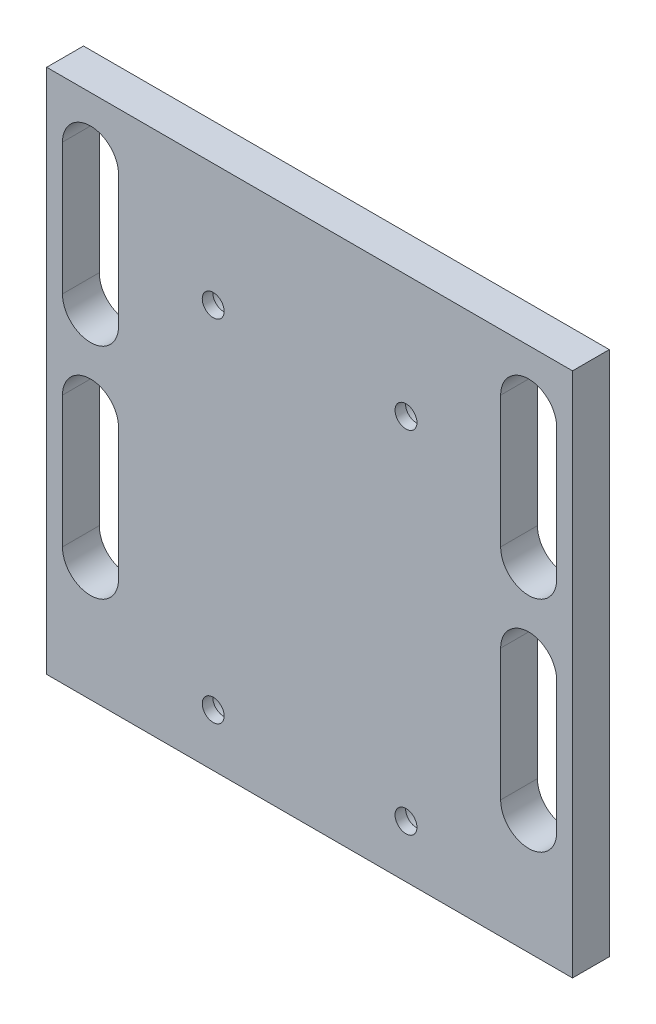
ISO-10303-21;
HEADER;
FILE_DESCRIPTION(('STEP AP214'),'2;1');
FILE_NAME('part.step','',(''),(''),'','','');
FILE_SCHEMA(('AUTOMOTIVE_DESIGN { 1 0 10303 214 1 1 1 1 }'));
ENDSEC;
DATA;
#1=APPLICATION_CONTEXT('core data for automotive mechanical design processes');
#2=APPLICATION_PROTOCOL_DEFINITION('international standard','automotive_design',2000,#1);
#3=PRODUCT_CONTEXT('',#1,'mechanical');
#4=PRODUCT('Part','Part','',(#3));
#5=PRODUCT_RELATED_PRODUCT_CATEGORY('part','',(#4));
#6=PRODUCT_DEFINITION_FORMATION('','',#4);
#7=PRODUCT_DEFINITION_CONTEXT('part definition',#1,'design');
#8=PRODUCT_DEFINITION('design','',#6,#7);
#9=PRODUCT_DEFINITION_SHAPE('','',#8);
#10=(LENGTH_UNIT() NAMED_UNIT(*) SI_UNIT(.MILLI.,.METRE.));
#11=(NAMED_UNIT(*) PLANE_ANGLE_UNIT() SI_UNIT($,.RADIAN.));
#12=(NAMED_UNIT(*) SI_UNIT($,.STERADIAN.) SOLID_ANGLE_UNIT());
#13=UNCERTAINTY_MEASURE_WITH_UNIT(LENGTH_MEASURE(1.E-05),#10,'distance_accuracy_value','');
#14=(GEOMETRIC_REPRESENTATION_CONTEXT(3) GLOBAL_UNCERTAINTY_ASSIGNED_CONTEXT((#13)) GLOBAL_UNIT_ASSIGNED_CONTEXT((#10,
#11,#12)) REPRESENTATION_CONTEXT('',''));
#15=CARTESIAN_POINT('',(0.,0.,0.));
#16=DIRECTION('',(0.,0.,1.));
#17=DIRECTION('',(1.,0.,0.));
#18=AXIS2_PLACEMENT_3D('',#15,#16,#17);
#19=CARTESIAN_POINT('',(-11.,20.,4.2));
#20=DIRECTION('',(0.,0.,-1.));
#21=DIRECTION('',(-1.,0.,0.));
#22=AXIS2_PLACEMENT_3D('',#19,#20,#21);
#23=CYLINDRICAL_SURFACE('',#22,1.25);
#24=CARTESIAN_POINT('',(-11.,20.,4.2));
#25=DIRECTION('',(0.,0.,1.));
#26=DIRECTION('',(1.,0.,0.));
#27=AXIS2_PLACEMENT_3D('',#24,#25,#26);
#28=CIRCLE('',#27,1.25);
#29=CARTESIAN_POINT('',(-9.75,20.,4.2));
#30=VERTEX_POINT('',#29);
#31=EDGE_CURVE('E312',#30,#30,#28,.T.);
#32=ORIENTED_EDGE('',*,*,#31,.T.);
#33=EDGE_LOOP('',(#32));
#34=FACE_BOUND('',#33,.T.);
#35=CARTESIAN_POINT('',(-11.,20.,3.));
#36=DIRECTION('',(0.,0.,-1.));
#37=DIRECTION('',(-1.,0.,0.));
#38=AXIS2_PLACEMENT_3D('',#35,#36,#37);
#39=CIRCLE('',#38,1.25);
#40=CARTESIAN_POINT('',(-12.25,20.,3.));
#41=VERTEX_POINT('',#40);
#42=EDGE_CURVE('E37',#41,#41,#39,.T.);
#43=ORIENTED_EDGE('',*,*,#42,.T.);
#44=EDGE_LOOP('',(#43));
#45=FACE_BOUND('',#44,.T.);
#46=ADVANCED_FACE('F33',(#34,#45),#23,.F.);
#47=CARTESIAN_POINT('',(-11.,-20.,4.2));
#48=DIRECTION('',(0.,0.,-1.));
#49=DIRECTION('',(-1.,0.,0.));
#50=AXIS2_PLACEMENT_3D('',#47,#48,#49);
#51=CYLINDRICAL_SURFACE('',#50,1.25);
#52=CARTESIAN_POINT('',(-11.,-20.,4.2));
#53=DIRECTION('',(0.,0.,1.));
#54=DIRECTION('',(-1.,0.,0.));
#55=AXIS2_PLACEMENT_3D('',#52,#53,#54);
#56=CIRCLE('',#55,1.25);
#57=CARTESIAN_POINT('',(-12.25,-20.,4.2));
#58=VERTEX_POINT('',#57);
#59=EDGE_CURVE('E309',#58,#58,#56,.T.);
#60=ORIENTED_EDGE('',*,*,#59,.T.);
#61=EDGE_LOOP('',(#60));
#62=FACE_BOUND('',#61,.T.);
#63=CARTESIAN_POINT('',(-11.,-20.,3.));
#64=DIRECTION('',(0.,0.,-1.));
#65=DIRECTION('',(-1.,0.,0.));
#66=AXIS2_PLACEMENT_3D('',#63,#64,#65);
#67=CIRCLE('',#66,1.25);
#68=CARTESIAN_POINT('',(-12.25,-20.,3.));
#69=VERTEX_POINT('',#68);
#70=EDGE_CURVE('E346',#69,#69,#67,.T.);
#71=ORIENTED_EDGE('',*,*,#70,.T.);
#72=EDGE_LOOP('',(#71));
#73=FACE_BOUND('',#72,.T.);
#74=ADVANCED_FACE('F422',(#62,#73),#51,.F.);
#75=CARTESIAN_POINT('',(11.,-20.,4.2));
#76=DIRECTION('',(0.,0.,-1.));
#77=DIRECTION('',(-1.,0.,0.));
#78=AXIS2_PLACEMENT_3D('',#75,#76,#77);
#79=CYLINDRICAL_SURFACE('',#78,1.25);
#80=CARTESIAN_POINT('',(11.,-20.,4.2));
#81=DIRECTION('',(0.,0.,1.));
#82=DIRECTION('',(1.,0.,0.));
#83=AXIS2_PLACEMENT_3D('',#80,#81,#82);
#84=CIRCLE('',#83,1.25);
#85=CARTESIAN_POINT('',(12.25,-20.,4.2));
#86=VERTEX_POINT('',#85);
#87=EDGE_CURVE('E306',#86,#86,#84,.T.);
#88=ORIENTED_EDGE('',*,*,#87,.T.);
#89=EDGE_LOOP('',(#88));
#90=FACE_BOUND('',#89,.T.);
#91=CARTESIAN_POINT('',(11.,-20.,3.));
#92=DIRECTION('',(0.,0.,-1.));
#93=DIRECTION('',(-1.,0.,0.));
#94=AXIS2_PLACEMENT_3D('',#91,#92,#93);
#95=CIRCLE('',#94,1.25);
#96=CARTESIAN_POINT('',(9.75,-20.,3.));
#97=VERTEX_POINT('',#96);
#98=EDGE_CURVE('E344',#97,#97,#95,.T.);
#99=ORIENTED_EDGE('',*,*,#98,.T.);
#100=EDGE_LOOP('',(#99));
#101=FACE_BOUND('',#100,.T.);
#102=ADVANCED_FACE('F428',(#90,#101),#79,.F.);
#103=CARTESIAN_POINT('',(11.,20.,4.2));
#104=DIRECTION('',(0.,0.,-1.));
#105=DIRECTION('',(-1.,0.,0.));
#106=AXIS2_PLACEMENT_3D('',#103,#104,#105);
#107=CYLINDRICAL_SURFACE('',#106,1.25);
#108=CARTESIAN_POINT('',(11.,20.,4.2));
#109=DIRECTION('',(0.,0.,1.));
#110=DIRECTION('',(-1.,0.,0.));
#111=AXIS2_PLACEMENT_3D('',#108,#109,#110);
#112=CIRCLE('',#111,1.25);
#113=CARTESIAN_POINT('',(9.75,20.,4.2));
#114=VERTEX_POINT('',#113);
#115=EDGE_CURVE('E303',#114,#114,#112,.T.);
#116=ORIENTED_EDGE('',*,*,#115,.T.);
#117=EDGE_LOOP('',(#116));
#118=FACE_BOUND('',#117,.T.);
#119=CARTESIAN_POINT('',(11.,20.,3.));
#120=DIRECTION('',(0.,0.,-1.));
#121=DIRECTION('',(-1.,0.,0.));
#122=AXIS2_PLACEMENT_3D('',#119,#120,#121);
#123=CIRCLE('',#122,1.25);
#124=CARTESIAN_POINT('',(9.75,20.,3.));
#125=VERTEX_POINT('',#124);
#126=EDGE_CURVE('E201',#125,#125,#123,.T.);
#127=ORIENTED_EDGE('',*,*,#126,.T.);
#128=EDGE_LOOP('',(#127));
#129=FACE_BOUND('',#128,.T.);
#130=ADVANCED_FACE('F434',(#118,#129),#107,.F.);
#131=CARTESIAN_POINT('',(0.,0.,4.2));
#132=DIRECTION('',(0.,0.,-1.));
#133=DIRECTION('',(-1.,0.,0.));
#134=AXIS2_PLACEMENT_3D('',#131,#132,#133);
#135=PLANE('',#134);
#136=CARTESIAN_POINT('',(25.,27.5,4.2));
#137=DIRECTION('',(0.,0.,1.));
#138=DIRECTION('',(1.,0.,0.));
#139=AXIS2_PLACEMENT_3D('',#136,#137,#138);
#140=CIRCLE('',#139,3.20000000000001);
#141=CARTESIAN_POINT('',(28.2,27.5,4.2));
#142=VERTEX_POINT('',#141);
#143=CARTESIAN_POINT('',(21.8,27.5,4.2));
#144=VERTEX_POINT('',#143);
#145=EDGE_CURVE('E211',#142,#144,#140,.T.);
#146=ORIENTED_EDGE('',*,*,#145,.F.);
#147=DIRECTION('',(0.,1.,0.));
#148=VECTOR('',#147,1.);
#149=CARTESIAN_POINT('',(28.2,27.5,4.2));
#150=LINE('',#149,#148);
#151=CARTESIAN_POINT('',(28.2,12.5,4.2));
#152=VERTEX_POINT('',#151);
#153=EDGE_CURVE('E219',#152,#142,#150,.T.);
#154=ORIENTED_EDGE('',*,*,#153,.F.);
#155=CARTESIAN_POINT('',(25.,12.5,4.2));
#156=DIRECTION('',(0.,0.,1.));
#157=DIRECTION('',(-1.,0.,0.));
#158=AXIS2_PLACEMENT_3D('',#155,#156,#157);
#159=CIRCLE('',#158,3.20000000000001);
#160=CARTESIAN_POINT('',(21.8,12.5,4.2));
#161=VERTEX_POINT('',#160);
#162=EDGE_CURVE('E216',#161,#152,#159,.T.);
#163=ORIENTED_EDGE('',*,*,#162,.F.);
#164=DIRECTION('',(0.,-1.,0.));
#165=VECTOR('',#164,1.);
#166=CARTESIAN_POINT('',(21.8,27.5,4.2));
#167=LINE('',#166,#165);
#168=EDGE_CURVE('E213',#144,#161,#167,.T.);
#169=ORIENTED_EDGE('',*,*,#168,.F.);
#170=EDGE_LOOP('',(#146,#154,#163,#169));
#171=FACE_BOUND('',#170,.T.);
#172=CARTESIAN_POINT('',(-25.,27.5,4.2));
#173=DIRECTION('',(0.,0.,1.));
#174=DIRECTION('',(1.,0.,0.));
#175=AXIS2_PLACEMENT_3D('',#172,#173,#174);
#176=CIRCLE('',#175,3.20000000000001);
#177=CARTESIAN_POINT('',(-21.8,27.5,4.2));
#178=VERTEX_POINT('',#177);
#179=CARTESIAN_POINT('',(-28.2,27.5,4.2));
#180=VERTEX_POINT('',#179);
#181=EDGE_CURVE('E273',#178,#180,#176,.T.);
#182=ORIENTED_EDGE('',*,*,#181,.F.);
#183=DIRECTION('',(0.,1.,0.));
#184=VECTOR('',#183,1.);
#185=CARTESIAN_POINT('',(-21.8,27.5,4.2));
#186=LINE('',#185,#184);
#187=CARTESIAN_POINT('',(-21.8,12.5,4.2));
#188=VERTEX_POINT('',#187);
#189=EDGE_CURVE('E281',#188,#178,#186,.T.);
#190=ORIENTED_EDGE('',*,*,#189,.F.);
#191=CARTESIAN_POINT('',(-25.,12.5,4.2));
#192=DIRECTION('',(0.,0.,1.));
#193=DIRECTION('',(1.,0.,0.));
#194=AXIS2_PLACEMENT_3D('',#191,#192,#193);
#195=CIRCLE('',#194,3.20000000000001);
#196=CARTESIAN_POINT('',(-28.2,12.5,4.2));
#197=VERTEX_POINT('',#196);
#198=EDGE_CURVE('E278',#197,#188,#195,.T.);
#199=ORIENTED_EDGE('',*,*,#198,.F.);
#200=DIRECTION('',(0.,-1.,0.));
#201=VECTOR('',#200,1.);
#202=CARTESIAN_POINT('',(-28.2,27.5,4.2));
#203=LINE('',#202,#201);
#204=EDGE_CURVE('E275',#180,#197,#203,.T.);
#205=ORIENTED_EDGE('',*,*,#204,.F.);
#206=EDGE_LOOP('',(#182,#190,#199,#205));
#207=FACE_BOUND('',#206,.T.);
#208=DIRECTION('',(0.,-1.,0.));
#209=VECTOR('',#208,1.);
#210=CARTESIAN_POINT('',(-30.,-26.,4.2));
#211=LINE('',#210,#209);
#212=CARTESIAN_POINT('',(-30.,34.,4.2));
#213=VERTEX_POINT('',#212);
#214=CARTESIAN_POINT('',(-30.,-26.,4.2));
#215=VERTEX_POINT('',#214);
#216=EDGE_CURVE('E316',#213,#215,#211,.T.);
#217=ORIENTED_EDGE('',*,*,#216,.T.);
#218=DIRECTION('',(1.,0.,0.));
#219=VECTOR('',#218,1.);
#220=CARTESIAN_POINT('',(-30.,-26.,4.2));
#221=LINE('',#220,#219);
#222=CARTESIAN_POINT('',(30.,-26.,4.2));
#223=VERTEX_POINT('',#222);
#224=EDGE_CURVE('E319',#215,#223,#221,.T.);
#225=ORIENTED_EDGE('',*,*,#224,.T.);
#226=DIRECTION('',(0.,1.,0.));
#227=VECTOR('',#226,1.);
#228=CARTESIAN_POINT('',(30.,34.,4.2));
#229=LINE('',#228,#227);
#230=CARTESIAN_POINT('',(30.,34.,4.2));
#231=VERTEX_POINT('',#230);
#232=EDGE_CURVE('E322',#223,#231,#229,.T.);
#233=ORIENTED_EDGE('',*,*,#232,.T.);
#234=DIRECTION('',(-1.,0.,0.));
#235=VECTOR('',#234,1.);
#236=CARTESIAN_POINT('',(-30.,34.,4.2));
#237=LINE('',#236,#235);
#238=EDGE_CURVE('E324',#231,#213,#237,.T.);
#239=ORIENTED_EDGE('',*,*,#238,.T.);
#240=EDGE_LOOP('',(#217,#225,#233,#239));
#241=FACE_BOUND('',#240,.T.);
#242=ORIENTED_EDGE('',*,*,#31,.F.);
#243=EDGE_LOOP('',(#242));
#244=FACE_BOUND('',#243,.T.);
#245=ORIENTED_EDGE('',*,*,#59,.F.);
#246=EDGE_LOOP('',(#245));
#247=FACE_BOUND('',#246,.T.);
#248=ORIENTED_EDGE('',*,*,#87,.F.);
#249=EDGE_LOOP('',(#248));
#250=FACE_BOUND('',#249,.T.);
#251=ORIENTED_EDGE('',*,*,#115,.F.);
#252=EDGE_LOOP('',(#251));
#253=FACE_BOUND('',#252,.T.);
#254=CARTESIAN_POINT('',(-25.,2.5,4.2));
#255=DIRECTION('',(0.,0.,1.));
#256=DIRECTION('',(1.,0.,0.));
#257=AXIS2_PLACEMENT_3D('',#254,#255,#256);
#258=CIRCLE('',#257,3.2);
#259=CARTESIAN_POINT('',(-21.8,2.5,4.2));
#260=VERTEX_POINT('',#259);
#261=CARTESIAN_POINT('',(-28.2,2.5,4.2));
#262=VERTEX_POINT('',#261);
#263=EDGE_CURVE('E242',#260,#262,#258,.T.);
#264=ORIENTED_EDGE('',*,*,#263,.F.);
#265=DIRECTION('',(0.,1.,0.));
#266=VECTOR('',#265,1.);
#267=CARTESIAN_POINT('',(-21.8,2.5,4.2));
#268=LINE('',#267,#266);
#269=CARTESIAN_POINT('',(-21.8,-12.5,4.2));
#270=VERTEX_POINT('',#269);
#271=EDGE_CURVE('E250',#270,#260,#268,.T.);
#272=ORIENTED_EDGE('',*,*,#271,.F.);
#273=CARTESIAN_POINT('',(-25.,-12.5,4.2));
#274=DIRECTION('',(0.,0.,1.));
#275=DIRECTION('',(-1.,0.,0.));
#276=AXIS2_PLACEMENT_3D('',#273,#274,#275);
#277=CIRCLE('',#276,3.20000000000001);
#278=CARTESIAN_POINT('',(-28.2,-12.5,4.2));
#279=VERTEX_POINT('',#278);
#280=EDGE_CURVE('E247',#279,#270,#277,.T.);
#281=ORIENTED_EDGE('',*,*,#280,.F.);
#282=DIRECTION('',(0.,-1.,0.));
#283=VECTOR('',#282,1.);
#284=CARTESIAN_POINT('',(-28.2,2.5,4.2));
#285=LINE('',#284,#283);
#286=EDGE_CURVE('E244',#262,#279,#285,.T.);
#287=ORIENTED_EDGE('',*,*,#286,.F.);
#288=EDGE_LOOP('',(#264,#272,#281,#287));
#289=FACE_BOUND('',#288,.T.);
#290=CARTESIAN_POINT('',(25.,2.5,4.2));
#291=DIRECTION('',(0.,0.,1.));
#292=DIRECTION('',(1.,0.,0.));
#293=AXIS2_PLACEMENT_3D('',#290,#291,#292);
#294=CIRCLE('',#293,3.2);
#295=CARTESIAN_POINT('',(28.2,2.5,4.2));
#296=VERTEX_POINT('',#295);
#297=CARTESIAN_POINT('',(21.8,2.5,4.2));
#298=VERTEX_POINT('',#297);
#299=EDGE_CURVE('E172',#296,#298,#294,.T.);
#300=ORIENTED_EDGE('',*,*,#299,.F.);
#301=DIRECTION('',(0.,1.,0.));
#302=VECTOR('',#301,1.);
#303=CARTESIAN_POINT('',(28.2,2.5,4.2));
#304=LINE('',#303,#302);
#305=CARTESIAN_POINT('',(28.2,-12.5,4.2));
#306=VERTEX_POINT('',#305);
#307=EDGE_CURVE('E195',#306,#296,#304,.T.);
#308=ORIENTED_EDGE('',*,*,#307,.F.);
#309=CARTESIAN_POINT('',(25.,-12.5,4.2));
#310=DIRECTION('',(0.,0.,1.));
#311=DIRECTION('',(1.,0.,0.));
#312=AXIS2_PLACEMENT_3D('',#309,#310,#311);
#313=CIRCLE('',#312,3.20000000000001);
#314=CARTESIAN_POINT('',(21.8,-12.5,4.2));
#315=VERTEX_POINT('',#314);
#316=EDGE_CURVE('E193',#315,#306,#313,.T.);
#317=ORIENTED_EDGE('',*,*,#316,.F.);
#318=DIRECTION('',(0.,-1.,0.));
#319=VECTOR('',#318,1.);
#320=CARTESIAN_POINT('',(21.8,2.5,4.2));
#321=LINE('',#320,#319);
#322=EDGE_CURVE('E180',#298,#315,#321,.T.);
#323=ORIENTED_EDGE('',*,*,#322,.F.);
#324=EDGE_LOOP('',(#300,#308,#317,#323));
#325=FACE_BOUND('',#324,.T.);
#326=ADVANCED_FACE('F192',(#171,#207,#241,#244,#247,#250,#253,#289,#325),#135,.F.);
#327=CARTESIAN_POINT('',(0.,0.,0.));
#328=DIRECTION('',(0.,0.,-1.));
#329=DIRECTION('',(-1.,0.,0.));
#330=AXIS2_PLACEMENT_3D('',#327,#328,#329);
#331=PLANE('',#330);
#332=CARTESIAN_POINT('',(-11.,20.,0.));
#333=DIRECTION('',(0.,0.,-1.));
#334=DIRECTION('',(-1.,0.,0.));
#335=AXIS2_PLACEMENT_3D('',#332,#333,#334);
#336=CIRCLE('',#335,2.5);
#337=CARTESIAN_POINT('',(-13.5,20.,0.));
#338=VERTEX_POINT('',#337);
#339=EDGE_CURVE('E373',#338,#338,#336,.T.);
#340=ORIENTED_EDGE('',*,*,#339,.F.);
#341=EDGE_LOOP('',(#340));
#342=FACE_BOUND('',#341,.T.);
#343=CARTESIAN_POINT('',(11.,-20.,0.));
#344=DIRECTION('',(0.,0.,-1.));
#345=DIRECTION('',(-1.,0.,0.));
#346=AXIS2_PLACEMENT_3D('',#343,#344,#345);
#347=CIRCLE('',#346,2.5);
#348=CARTESIAN_POINT('',(8.49999999999999,-20.,0.));
#349=VERTEX_POINT('',#348);
#350=EDGE_CURVE('E367',#349,#349,#347,.T.);
#351=ORIENTED_EDGE('',*,*,#350,.F.);
#352=EDGE_LOOP('',(#351));
#353=FACE_BOUND('',#352,.T.);
#354=CARTESIAN_POINT('',(-11.,-20.,0.));
#355=DIRECTION('',(0.,0.,-1.));
#356=DIRECTION('',(-1.,0.,0.));
#357=AXIS2_PLACEMENT_3D('',#354,#355,#356);
#358=CIRCLE('',#357,2.5);
#359=CARTESIAN_POINT('',(-13.5,-20.,0.));
#360=VERTEX_POINT('',#359);
#361=EDGE_CURVE('E361',#360,#360,#358,.T.);
#362=ORIENTED_EDGE('',*,*,#361,.F.);
#363=EDGE_LOOP('',(#362));
#364=FACE_BOUND('',#363,.T.);
#365=CARTESIAN_POINT('',(11.,20.,0.));
#366=DIRECTION('',(0.,0.,-1.));
#367=DIRECTION('',(-1.,0.,0.));
#368=AXIS2_PLACEMENT_3D('',#365,#366,#367);
#369=CIRCLE('',#368,2.5);
#370=CARTESIAN_POINT('',(8.5,20.,0.));
#371=VERTEX_POINT('',#370);
#372=EDGE_CURVE('E352',#371,#371,#369,.T.);
#373=ORIENTED_EDGE('',*,*,#372,.F.);
#374=EDGE_LOOP('',(#373));
#375=FACE_BOUND('',#374,.T.);
#376=DIRECTION('',(0.,-1.,0.));
#377=VECTOR('',#376,1.);
#378=CARTESIAN_POINT('',(-30.,-26.,0.));
#379=LINE('',#378,#377);
#380=CARTESIAN_POINT('',(-30.,34.,0.));
#381=VERTEX_POINT('',#380);
#382=CARTESIAN_POINT('',(-30.,-26.,0.));
#383=VERTEX_POINT('',#382);
#384=EDGE_CURVE('E315',#381,#383,#379,.T.);
#385=ORIENTED_EDGE('',*,*,#384,.F.);
#386=DIRECTION('',(-1.,0.,0.));
#387=VECTOR('',#386,1.);
#388=CARTESIAN_POINT('',(-30.,34.,0.));
#389=LINE('',#388,#387);
#390=CARTESIAN_POINT('',(30.,34.,0.));
#391=VERTEX_POINT('',#390);
#392=EDGE_CURVE('E320',#391,#381,#389,.T.);
#393=ORIENTED_EDGE('',*,*,#392,.F.);
#394=DIRECTION('',(0.,1.,0.));
#395=VECTOR('',#394,1.);
#396=CARTESIAN_POINT('',(30.,34.,0.));
#397=LINE('',#396,#395);
#398=CARTESIAN_POINT('',(30.,-26.,0.));
#399=VERTEX_POINT('',#398);
#400=EDGE_CURVE('E331',#399,#391,#397,.T.);
#401=ORIENTED_EDGE('',*,*,#400,.F.);
#402=DIRECTION('',(1.,0.,0.));
#403=VECTOR('',#402,1.);
#404=CARTESIAN_POINT('',(-30.,-26.,0.));
#405=LINE('',#404,#403);
#406=EDGE_CURVE('E329',#383,#399,#405,.T.);
#407=ORIENTED_EDGE('',*,*,#406,.F.);
#408=EDGE_LOOP('',(#385,#393,#401,#407));
#409=FACE_BOUND('',#408,.T.);
#410=DIRECTION('',(0.,1.,0.));
#411=VECTOR('',#410,1.);
#412=CARTESIAN_POINT('',(-21.8,27.5,0.));
#413=LINE('',#412,#411);
#414=CARTESIAN_POINT('',(-21.8,12.5,0.));
#415=VERTEX_POINT('',#414);
#416=CARTESIAN_POINT('',(-21.8,27.5,0.));
#417=VERTEX_POINT('',#416);
#418=EDGE_CURVE('E276',#415,#417,#413,.T.);
#419=ORIENTED_EDGE('',*,*,#418,.T.);
#420=CARTESIAN_POINT('',(-25.,27.5,0.));
#421=DIRECTION('',(0.,0.,1.));
#422=DIRECTION('',(1.,0.,0.));
#423=AXIS2_PLACEMENT_3D('',#420,#421,#422);
#424=CIRCLE('',#423,3.20000000000001);
#425=CARTESIAN_POINT('',(-28.2,27.5,0.));
#426=VERTEX_POINT('',#425);
#427=EDGE_CURVE('E272',#417,#426,#424,.T.);
#428=ORIENTED_EDGE('',*,*,#427,.T.);
#429=DIRECTION('',(0.,-1.,0.));
#430=VECTOR('',#429,1.);
#431=CARTESIAN_POINT('',(-28.2,27.5,0.));
#432=LINE('',#431,#430);
#433=CARTESIAN_POINT('',(-28.2,12.5,0.));
#434=VERTEX_POINT('',#433);
#435=EDGE_CURVE('E286',#426,#434,#432,.T.);
#436=ORIENTED_EDGE('',*,*,#435,.T.);
#437=CARTESIAN_POINT('',(-25.,12.5,0.));
#438=DIRECTION('',(0.,0.,1.));
#439=DIRECTION('',(1.,0.,0.));
#440=AXIS2_PLACEMENT_3D('',#437,#438,#439);
#441=CIRCLE('',#440,3.20000000000001);
#442=EDGE_CURVE('E289',#434,#415,#441,.T.);
#443=ORIENTED_EDGE('',*,*,#442,.T.);
#444=EDGE_LOOP('',(#419,#428,#436,#443));
#445=FACE_BOUND('',#444,.T.);
#446=DIRECTION('',(0.,1.,0.));
#447=VECTOR('',#446,1.);
#448=CARTESIAN_POINT('',(-21.8,2.5,0.));
#449=LINE('',#448,#447);
#450=CARTESIAN_POINT('',(-21.8,-12.5,0.));
#451=VERTEX_POINT('',#450);
#452=CARTESIAN_POINT('',(-21.8,2.5,0.));
#453=VERTEX_POINT('',#452);
#454=EDGE_CURVE('E245',#451,#453,#449,.T.);
#455=ORIENTED_EDGE('',*,*,#454,.T.);
#456=CARTESIAN_POINT('',(-25.,2.5,0.));
#457=DIRECTION('',(0.,0.,1.));
#458=DIRECTION('',(1.,0.,0.));
#459=AXIS2_PLACEMENT_3D('',#456,#457,#458);
#460=CIRCLE('',#459,3.2);
#461=CARTESIAN_POINT('',(-28.2,2.5,0.));
#462=VERTEX_POINT('',#461);
#463=EDGE_CURVE('E241',#453,#462,#460,.T.);
#464=ORIENTED_EDGE('',*,*,#463,.T.);
#465=DIRECTION('',(0.,-1.,0.));
#466=VECTOR('',#465,1.);
#467=CARTESIAN_POINT('',(-28.2,2.5,0.));
#468=LINE('',#467,#466);
#469=CARTESIAN_POINT('',(-28.2,-12.5,0.));
#470=VERTEX_POINT('',#469);
#471=EDGE_CURVE('E255',#462,#470,#468,.T.);
#472=ORIENTED_EDGE('',*,*,#471,.T.);
#473=CARTESIAN_POINT('',(-25.,-12.5,0.));
#474=DIRECTION('',(0.,0.,1.));
#475=DIRECTION('',(-1.,0.,0.));
#476=AXIS2_PLACEMENT_3D('',#473,#474,#475);
#477=CIRCLE('',#476,3.20000000000001);
#478=EDGE_CURVE('E258',#470,#451,#477,.T.);
#479=ORIENTED_EDGE('',*,*,#478,.T.);
#480=EDGE_LOOP('',(#455,#464,#472,#479));
#481=FACE_BOUND('',#480,.T.);
#482=DIRECTION('',(0.,1.,0.));
#483=VECTOR('',#482,1.);
#484=CARTESIAN_POINT('',(28.2,27.5,0.));
#485=LINE('',#484,#483);
#486=CARTESIAN_POINT('',(28.2,12.5,0.));
#487=VERTEX_POINT('',#486);
#488=CARTESIAN_POINT('',(28.2,27.5,0.));
#489=VERTEX_POINT('',#488);
#490=EDGE_CURVE('E214',#487,#489,#485,.T.);
#491=ORIENTED_EDGE('',*,*,#490,.T.);
#492=CARTESIAN_POINT('',(25.,27.5,0.));
#493=DIRECTION('',(0.,0.,1.));
#494=DIRECTION('',(1.,0.,0.));
#495=AXIS2_PLACEMENT_3D('',#492,#493,#494);
#496=CIRCLE('',#495,3.20000000000001);
#497=CARTESIAN_POINT('',(21.8,27.5,0.));
#498=VERTEX_POINT('',#497);
#499=EDGE_CURVE('E188',#489,#498,#496,.T.);
#500=ORIENTED_EDGE('',*,*,#499,.T.);
#501=DIRECTION('',(0.,-1.,0.));
#502=VECTOR('',#501,1.);
#503=CARTESIAN_POINT('',(21.8,27.5,0.));
#504=LINE('',#503,#502);
#505=CARTESIAN_POINT('',(21.8,12.5,0.));
#506=VERTEX_POINT('',#505);
#507=EDGE_CURVE('E224',#498,#506,#504,.T.);
#508=ORIENTED_EDGE('',*,*,#507,.T.);
#509=CARTESIAN_POINT('',(25.,12.5,0.));
#510=DIRECTION('',(0.,0.,1.));
#511=DIRECTION('',(-1.,0.,0.));
#512=AXIS2_PLACEMENT_3D('',#509,#510,#511);
#513=CIRCLE('',#512,3.20000000000001);
#514=EDGE_CURVE('E227',#506,#487,#513,.T.);
#515=ORIENTED_EDGE('',*,*,#514,.T.);
#516=EDGE_LOOP('',(#491,#500,#508,#515));
#517=FACE_BOUND('',#516,.T.);
#518=DIRECTION('',(0.,1.,0.));
#519=VECTOR('',#518,1.);
#520=CARTESIAN_POINT('',(28.2,2.5,0.));
#521=LINE('',#520,#519);
#522=CARTESIAN_POINT('',(28.2,-12.5,0.));
#523=VERTEX_POINT('',#522);
#524=CARTESIAN_POINT('',(28.2,2.5,0.));
#525=VERTEX_POINT('',#524);
#526=EDGE_CURVE('E181',#523,#525,#521,.T.);
#527=ORIENTED_EDGE('',*,*,#526,.T.);
#528=CARTESIAN_POINT('',(25.,2.5,0.));
#529=DIRECTION('',(0.,0.,1.));
#530=DIRECTION('',(1.,0.,0.));
#531=AXIS2_PLACEMENT_3D('',#528,#529,#530);
#532=CIRCLE('',#531,3.2);
#533=CARTESIAN_POINT('',(21.8,2.5,0.));
#534=VERTEX_POINT('',#533);
#535=EDGE_CURVE('E58',#525,#534,#532,.T.);
#536=ORIENTED_EDGE('',*,*,#535,.T.);
#537=DIRECTION('',(0.,-1.,0.));
#538=VECTOR('',#537,1.);
#539=CARTESIAN_POINT('',(21.8,2.5,0.));
#540=LINE('',#539,#538);
#541=CARTESIAN_POINT('',(21.8,-12.5,0.));
#542=VERTEX_POINT('',#541);
#543=EDGE_CURVE('E187',#534,#542,#540,.T.);
#544=ORIENTED_EDGE('',*,*,#543,.T.);
#545=CARTESIAN_POINT('',(25.,-12.5,0.));
#546=DIRECTION('',(0.,0.,1.));
#547=DIRECTION('',(1.,0.,0.));
#548=AXIS2_PLACEMENT_3D('',#545,#546,#547);
#549=CIRCLE('',#548,3.20000000000001);
#550=EDGE_CURVE('E203',#542,#523,#549,.T.);
#551=ORIENTED_EDGE('',*,*,#550,.T.);
#552=EDGE_LOOP('',(#527,#536,#544,#551));
#553=FACE_BOUND('',#552,.T.);
#554=ADVANCED_FACE('F388',(#342,#353,#364,#375,#409,#445,#481,#517,#553),#331,.T.);
#555=CARTESIAN_POINT('',(-30.,-26.,4.2));
#556=DIRECTION('',(1.,0.,0.));
#557=DIRECTION('',(0.,0.,-1.));
#558=AXIS2_PLACEMENT_3D('',#555,#556,#557);
#559=PLANE('',#558);
#560=ORIENTED_EDGE('',*,*,#384,.T.);
#561=DIRECTION('',(0.,0.,-1.));
#562=VECTOR('',#561,1.);
#563=CARTESIAN_POINT('',(-30.,-26.,4.2));
#564=LINE('',#563,#562);
#565=EDGE_CURVE('E11',#215,#383,#564,.T.);
#566=ORIENTED_EDGE('',*,*,#565,.F.);
#567=ORIENTED_EDGE('',*,*,#216,.F.);
#568=DIRECTION('',(0.,0.,-1.));
#569=VECTOR('',#568,1.);
#570=CARTESIAN_POINT('',(-30.,34.,4.2));
#571=LINE('',#570,#569);
#572=EDGE_CURVE('E326',#213,#381,#571,.T.);
#573=ORIENTED_EDGE('',*,*,#572,.T.);
#574=EDGE_LOOP('',(#560,#566,#567,#573));
#575=FACE_BOUND('',#574,.T.);
#576=ADVANCED_FACE('F35',(#575),#559,.F.);
#577=CARTESIAN_POINT('',(-30.,-26.,4.2));
#578=DIRECTION('',(0.,1.,0.));
#579=DIRECTION('',(0.,0.,1.));
#580=AXIS2_PLACEMENT_3D('',#577,#578,#579);
#581=PLANE('',#580);
#582=ORIENTED_EDGE('',*,*,#406,.T.);
#583=DIRECTION('',(0.,0.,-1.));
#584=VECTOR('',#583,1.);
#585=CARTESIAN_POINT('',(30.,-26.,4.2));
#586=LINE('',#585,#584);
#587=EDGE_CURVE('E42',#223,#399,#586,.T.);
#588=ORIENTED_EDGE('',*,*,#587,.F.);
#589=ORIENTED_EDGE('',*,*,#224,.F.);
#590=ORIENTED_EDGE('',*,*,#565,.T.);
#591=EDGE_LOOP('',(#582,#588,#589,#590));
#592=FACE_BOUND('',#591,.T.);
#593=ADVANCED_FACE('F444',(#592),#581,.F.);
#594=CARTESIAN_POINT('',(30.,34.,4.2));
#595=DIRECTION('',(-1.,0.,0.));
#596=DIRECTION('',(0.,-1.,0.));
#597=AXIS2_PLACEMENT_3D('',#594,#595,#596);
#598=PLANE('',#597);
#599=ORIENTED_EDGE('',*,*,#400,.T.);
#600=DIRECTION('',(0.,0.,-1.));
#601=VECTOR('',#600,1.);
#602=CARTESIAN_POINT('',(30.,34.,4.2));
#603=LINE('',#602,#601);
#604=EDGE_CURVE('E336',#231,#391,#603,.T.);
#605=ORIENTED_EDGE('',*,*,#604,.F.);
#606=ORIENTED_EDGE('',*,*,#232,.F.);
#607=ORIENTED_EDGE('',*,*,#587,.T.);
#608=EDGE_LOOP('',(#599,#605,#606,#607));
#609=FACE_BOUND('',#608,.T.);
#610=ADVANCED_FACE('F441',(#609),#598,.F.);
#611=CARTESIAN_POINT('',(-30.,34.,4.2));
#612=DIRECTION('',(0.,-1.,0.));
#613=DIRECTION('',(0.,0.,-1.));
#614=AXIS2_PLACEMENT_3D('',#611,#612,#613);
#615=PLANE('',#614);
#616=ORIENTED_EDGE('',*,*,#392,.T.);
#617=ORIENTED_EDGE('',*,*,#572,.F.);
#618=ORIENTED_EDGE('',*,*,#238,.F.);
#619=ORIENTED_EDGE('',*,*,#604,.T.);
#620=EDGE_LOOP('',(#616,#617,#618,#619));
#621=FACE_BOUND('',#620,.T.);
#622=ADVANCED_FACE('F437',(#621),#615,.F.);
#623=CARTESIAN_POINT('',(-25.,27.5,4.2));
#624=DIRECTION('',(0.,0.,-1.));
#625=DIRECTION('',(-1.,0.,0.));
#626=AXIS2_PLACEMENT_3D('',#623,#624,#625);
#627=CYLINDRICAL_SURFACE('',#626,3.20000000000001);
#628=ORIENTED_EDGE('',*,*,#427,.F.);
#629=DIRECTION('',(0.,0.,-1.));
#630=VECTOR('',#629,1.);
#631=CARTESIAN_POINT('',(-21.8,27.5,4.2));
#632=LINE('',#631,#630);
#633=EDGE_CURVE('E283',#178,#417,#632,.T.);
#634=ORIENTED_EDGE('',*,*,#633,.F.);
#635=ORIENTED_EDGE('',*,*,#181,.T.);
#636=DIRECTION('',(0.,0.,-1.));
#637=VECTOR('',#636,1.);
#638=CARTESIAN_POINT('',(-28.2,27.5,4.2));
#639=LINE('',#638,#637);
#640=EDGE_CURVE('E300',#180,#426,#639,.T.);
#641=ORIENTED_EDGE('',*,*,#640,.T.);
#642=EDGE_LOOP('',(#628,#634,#635,#641));
#643=FACE_BOUND('',#642,.T.);
#644=ADVANCED_FACE('F440',(#643),#627,.F.);
#645=CARTESIAN_POINT('',(-28.2,27.5,4.2));
#646=DIRECTION('',(1.,0.,0.));
#647=DIRECTION('',(0.,0.,-1.));
#648=AXIS2_PLACEMENT_3D('',#645,#646,#647);
#649=PLANE('',#648);
#650=ORIENTED_EDGE('',*,*,#435,.F.);
#651=ORIENTED_EDGE('',*,*,#640,.F.);
#652=ORIENTED_EDGE('',*,*,#204,.T.);
#653=DIRECTION('',(0.,0.,-1.));
#654=VECTOR('',#653,1.);
#655=CARTESIAN_POINT('',(-28.2,12.5,4.2));
#656=LINE('',#655,#654);
#657=EDGE_CURVE('E298',#197,#434,#656,.T.);
#658=ORIENTED_EDGE('',*,*,#657,.T.);
#659=EDGE_LOOP('',(#650,#651,#652,#658));
#660=FACE_BOUND('',#659,.T.);
#661=ADVANCED_FACE('F506',(#660),#649,.T.);
#662=CARTESIAN_POINT('',(-25.,12.5,4.2));
#663=DIRECTION('',(0.,0.,-1.));
#664=DIRECTION('',(-1.,0.,0.));
#665=AXIS2_PLACEMENT_3D('',#662,#663,#664);
#666=CYLINDRICAL_SURFACE('',#665,3.20000000000001);
#667=ORIENTED_EDGE('',*,*,#442,.F.);
#668=ORIENTED_EDGE('',*,*,#657,.F.);
#669=ORIENTED_EDGE('',*,*,#198,.T.);
#670=DIRECTION('',(0.,0.,-1.));
#671=VECTOR('',#670,1.);
#672=CARTESIAN_POINT('',(-21.8,12.5,4.2));
#673=LINE('',#672,#671);
#674=EDGE_CURVE('E296',#188,#415,#673,.T.);
#675=ORIENTED_EDGE('',*,*,#674,.T.);
#676=EDGE_LOOP('',(#667,#668,#669,#675));
#677=FACE_BOUND('',#676,.T.);
#678=ADVANCED_FACE('F502',(#677),#666,.F.);
#679=CARTESIAN_POINT('',(-21.8,27.5,4.2));
#680=DIRECTION('',(-1.,0.,0.));
#681=DIRECTION('',(0.,0.,1.));
#682=AXIS2_PLACEMENT_3D('',#679,#680,#681);
#683=PLANE('',#682);
#684=ORIENTED_EDGE('',*,*,#418,.F.);
#685=ORIENTED_EDGE('',*,*,#674,.F.);
#686=ORIENTED_EDGE('',*,*,#189,.T.);
#687=ORIENTED_EDGE('',*,*,#633,.T.);
#688=EDGE_LOOP('',(#684,#685,#686,#687));
#689=FACE_BOUND('',#688,.T.);
#690=ADVANCED_FACE('F499',(#689),#683,.T.);
#691=CARTESIAN_POINT('',(-25.,2.5,4.2));
#692=DIRECTION('',(0.,0.,-1.));
#693=DIRECTION('',(-1.,0.,0.));
#694=AXIS2_PLACEMENT_3D('',#691,#692,#693);
#695=CYLINDRICAL_SURFACE('',#694,3.2);
#696=ORIENTED_EDGE('',*,*,#463,.F.);
#697=DIRECTION('',(0.,0.,-1.));
#698=VECTOR('',#697,1.);
#699=CARTESIAN_POINT('',(-21.8,2.5,4.2));
#700=LINE('',#699,#698);
#701=EDGE_CURVE('E252',#260,#453,#700,.T.);
#702=ORIENTED_EDGE('',*,*,#701,.F.);
#703=ORIENTED_EDGE('',*,*,#263,.T.);
#704=DIRECTION('',(0.,0.,-1.));
#705=VECTOR('',#704,1.);
#706=CARTESIAN_POINT('',(-28.2,2.5,4.2));
#707=LINE('',#706,#705);
#708=EDGE_CURVE('E269',#262,#462,#707,.T.);
#709=ORIENTED_EDGE('',*,*,#708,.T.);
#710=EDGE_LOOP('',(#696,#702,#703,#709));
#711=FACE_BOUND('',#710,.T.);
#712=ADVANCED_FACE('F477',(#711),#695,.F.);
#713=CARTESIAN_POINT('',(-28.2,2.5,4.2));
#714=DIRECTION('',(1.,0.,0.));
#715=DIRECTION('',(0.,1.,0.));
#716=AXIS2_PLACEMENT_3D('',#713,#714,#715);
#717=PLANE('',#716);
#718=ORIENTED_EDGE('',*,*,#471,.F.);
#719=ORIENTED_EDGE('',*,*,#708,.F.);
#720=ORIENTED_EDGE('',*,*,#286,.T.);
#721=DIRECTION('',(0.,0.,-1.));
#722=VECTOR('',#721,1.);
#723=CARTESIAN_POINT('',(-28.2,-12.5,4.2));
#724=LINE('',#723,#722);
#725=EDGE_CURVE('E267',#279,#470,#724,.T.);
#726=ORIENTED_EDGE('',*,*,#725,.T.);
#727=EDGE_LOOP('',(#718,#719,#720,#726));
#728=FACE_BOUND('',#727,.T.);
#729=ADVANCED_FACE('F479',(#728),#717,.T.);
#730=CARTESIAN_POINT('',(-25.,-12.5,4.2));
#731=DIRECTION('',(0.,0.,-1.));
#732=DIRECTION('',(-1.,0.,0.));
#733=AXIS2_PLACEMENT_3D('',#730,#731,#732);
#734=CYLINDRICAL_SURFACE('',#733,3.20000000000001);
#735=ORIENTED_EDGE('',*,*,#478,.F.);
#736=ORIENTED_EDGE('',*,*,#725,.F.);
#737=ORIENTED_EDGE('',*,*,#280,.T.);
#738=DIRECTION('',(0.,0.,-1.));
#739=VECTOR('',#738,1.);
#740=CARTESIAN_POINT('',(-21.8,-12.5,4.2));
#741=LINE('',#740,#739);
#742=EDGE_CURVE('E265',#270,#451,#741,.T.);
#743=ORIENTED_EDGE('',*,*,#742,.T.);
#744=EDGE_LOOP('',(#735,#736,#737,#743));
#745=FACE_BOUND('',#744,.T.);
#746=ADVANCED_FACE('F485',(#745),#734,.F.);
#747=CARTESIAN_POINT('',(-21.8,2.5,4.2));
#748=DIRECTION('',(-1.,0.,0.));
#749=DIRECTION('',(0.,-1.,0.));
#750=AXIS2_PLACEMENT_3D('',#747,#748,#749);
#751=PLANE('',#750);
#752=ORIENTED_EDGE('',*,*,#454,.F.);
#753=ORIENTED_EDGE('',*,*,#742,.F.);
#754=ORIENTED_EDGE('',*,*,#271,.T.);
#755=ORIENTED_EDGE('',*,*,#701,.T.);
#756=EDGE_LOOP('',(#752,#753,#754,#755));
#757=FACE_BOUND('',#756,.T.);
#758=ADVANCED_FACE('F483',(#757),#751,.T.);
#759=CARTESIAN_POINT('',(25.,27.5,4.2));
#760=DIRECTION('',(0.,0.,-1.));
#761=DIRECTION('',(-1.,0.,0.));
#762=AXIS2_PLACEMENT_3D('',#759,#760,#761);
#763=CYLINDRICAL_SURFACE('',#762,3.20000000000001);
#764=ORIENTED_EDGE('',*,*,#499,.F.);
#765=DIRECTION('',(0.,0.,-1.));
#766=VECTOR('',#765,1.);
#767=CARTESIAN_POINT('',(28.2,27.5,4.2));
#768=LINE('',#767,#766);
#769=EDGE_CURVE('E221',#142,#489,#768,.T.);
#770=ORIENTED_EDGE('',*,*,#769,.F.);
#771=ORIENTED_EDGE('',*,*,#145,.T.);
#772=DIRECTION('',(0.,0.,-1.));
#773=VECTOR('',#772,1.);
#774=CARTESIAN_POINT('',(21.8,27.5,4.2));
#775=LINE('',#774,#773);
#776=EDGE_CURVE('E238',#144,#498,#775,.T.);
#777=ORIENTED_EDGE('',*,*,#776,.T.);
#778=EDGE_LOOP('',(#764,#770,#771,#777));
#779=FACE_BOUND('',#778,.T.);
#780=ADVANCED_FACE('F492',(#779),#763,.F.);
#781=CARTESIAN_POINT('',(21.8,27.5,4.2));
#782=DIRECTION('',(1.,0.,0.));
#783=DIRECTION('',(0.,0.,-1.));
#784=AXIS2_PLACEMENT_3D('',#781,#782,#783);
#785=PLANE('',#784);
#786=ORIENTED_EDGE('',*,*,#507,.F.);
#787=ORIENTED_EDGE('',*,*,#776,.F.);
#788=ORIENTED_EDGE('',*,*,#168,.T.);
#789=DIRECTION('',(0.,0.,-1.));
#790=VECTOR('',#789,1.);
#791=CARTESIAN_POINT('',(21.8,12.5,4.2));
#792=LINE('',#791,#790);
#793=EDGE_CURVE('E236',#161,#506,#792,.T.);
#794=ORIENTED_EDGE('',*,*,#793,.T.);
#795=EDGE_LOOP('',(#786,#787,#788,#794));
#796=FACE_BOUND('',#795,.T.);
#797=ADVANCED_FACE('F653',(#796),#785,.T.);
#798=CARTESIAN_POINT('',(25.,12.5,4.2));
#799=DIRECTION('',(0.,0.,-1.));
#800=DIRECTION('',(-1.,0.,0.));
#801=AXIS2_PLACEMENT_3D('',#798,#799,#800);
#802=CYLINDRICAL_SURFACE('',#801,3.20000000000001);
#803=ORIENTED_EDGE('',*,*,#514,.F.);
#804=ORIENTED_EDGE('',*,*,#793,.F.);
#805=ORIENTED_EDGE('',*,*,#162,.T.);
#806=DIRECTION('',(0.,0.,-1.));
#807=VECTOR('',#806,1.);
#808=CARTESIAN_POINT('',(28.2,12.5,4.2));
#809=LINE('',#808,#807);
#810=EDGE_CURVE('E234',#152,#487,#809,.T.);
#811=ORIENTED_EDGE('',*,*,#810,.T.);
#812=EDGE_LOOP('',(#803,#804,#805,#811));
#813=FACE_BOUND('',#812,.T.);
#814=ADVANCED_FACE('F644',(#813),#802,.F.);
#815=CARTESIAN_POINT('',(28.2,27.5,4.2));
#816=DIRECTION('',(-1.,0.,0.));
#817=DIRECTION('',(0.,0.,1.));
#818=AXIS2_PLACEMENT_3D('',#815,#816,#817);
#819=PLANE('',#818);
#820=ORIENTED_EDGE('',*,*,#490,.F.);
#821=ORIENTED_EDGE('',*,*,#810,.F.);
#822=ORIENTED_EDGE('',*,*,#153,.T.);
#823=ORIENTED_EDGE('',*,*,#769,.T.);
#824=EDGE_LOOP('',(#820,#821,#822,#823));
#825=FACE_BOUND('',#824,.T.);
#826=ADVANCED_FACE('F636',(#825),#819,.T.);
#827=CARTESIAN_POINT('',(25.,2.5,4.2));
#828=DIRECTION('',(0.,0.,-1.));
#829=DIRECTION('',(-1.,0.,0.));
#830=AXIS2_PLACEMENT_3D('',#827,#828,#829);
#831=CYLINDRICAL_SURFACE('',#830,3.2);
#832=ORIENTED_EDGE('',*,*,#535,.F.);
#833=DIRECTION('',(0.,0.,-1.));
#834=VECTOR('',#833,1.);
#835=CARTESIAN_POINT('',(28.2,2.5,4.2));
#836=LINE('',#835,#834);
#837=EDGE_CURVE('E176',#296,#525,#836,.T.);
#838=ORIENTED_EDGE('',*,*,#837,.F.);
#839=ORIENTED_EDGE('',*,*,#299,.T.);
#840=DIRECTION('',(0.,0.,-1.));
#841=VECTOR('',#840,1.);
#842=CARTESIAN_POINT('',(21.8,2.5,4.2));
#843=LINE('',#842,#841);
#844=EDGE_CURVE('E175',#298,#534,#843,.T.);
#845=ORIENTED_EDGE('',*,*,#844,.T.);
#846=EDGE_LOOP('',(#832,#838,#839,#845));
#847=FACE_BOUND('',#846,.T.);
#848=ADVANCED_FACE('F174',(#847),#831,.F.);
#849=CARTESIAN_POINT('',(21.8,2.5,4.2));
#850=DIRECTION('',(1.,0.,0.));
#851=DIRECTION('',(0.,1.,0.));
#852=AXIS2_PLACEMENT_3D('',#849,#850,#851);
#853=PLANE('',#852);
#854=ORIENTED_EDGE('',*,*,#543,.F.);
#855=ORIENTED_EDGE('',*,*,#844,.F.);
#856=ORIENTED_EDGE('',*,*,#322,.T.);
#857=DIRECTION('',(0.,0.,-1.));
#858=VECTOR('',#857,1.);
#859=CARTESIAN_POINT('',(21.8,-12.5,4.2));
#860=LINE('',#859,#858);
#861=EDGE_CURVE('E189',#315,#542,#860,.T.);
#862=ORIENTED_EDGE('',*,*,#861,.T.);
#863=EDGE_LOOP('',(#854,#855,#856,#862));
#864=FACE_BOUND('',#863,.T.);
#865=ADVANCED_FACE('F184',(#864),#853,.T.);
#866=CARTESIAN_POINT('',(25.,-12.5,4.2));
#867=DIRECTION('',(0.,0.,-1.));
#868=DIRECTION('',(-1.,0.,0.));
#869=AXIS2_PLACEMENT_3D('',#866,#867,#868);
#870=CYLINDRICAL_SURFACE('',#869,3.20000000000001);
#871=ORIENTED_EDGE('',*,*,#550,.F.);
#872=ORIENTED_EDGE('',*,*,#861,.F.);
#873=ORIENTED_EDGE('',*,*,#316,.T.);
#874=DIRECTION('',(0.,0.,-1.));
#875=VECTOR('',#874,1.);
#876=CARTESIAN_POINT('',(28.2,-12.5,4.2));
#877=LINE('',#876,#875);
#878=EDGE_CURVE('E50',#306,#523,#877,.T.);
#879=ORIENTED_EDGE('',*,*,#878,.T.);
#880=EDGE_LOOP('',(#871,#872,#873,#879));
#881=FACE_BOUND('',#880,.T.);
#882=ADVANCED_FACE('F410',(#881),#870,.F.);
#883=CARTESIAN_POINT('',(28.2,2.5,4.2));
#884=DIRECTION('',(-1.,0.,0.));
#885=DIRECTION('',(0.,-1.,0.));
#886=AXIS2_PLACEMENT_3D('',#883,#884,#885);
#887=PLANE('',#886);
#888=ORIENTED_EDGE('',*,*,#526,.F.);
#889=ORIENTED_EDGE('',*,*,#878,.F.);
#890=ORIENTED_EDGE('',*,*,#307,.T.);
#891=ORIENTED_EDGE('',*,*,#837,.T.);
#892=EDGE_LOOP('',(#888,#889,#890,#891));
#893=FACE_BOUND('',#892,.T.);
#894=ADVANCED_FACE('F407',(#893),#887,.T.);
#895=CARTESIAN_POINT('',(11.,20.,3.));
#896=DIRECTION('',(0.,0.,-1.));
#897=DIRECTION('',(-1.,0.,0.));
#898=AXIS2_PLACEMENT_3D('',#895,#896,#897);
#899=CYLINDRICAL_SURFACE('',#898,2.5);
#900=CARTESIAN_POINT('',(11.,20.,3.));
#901=DIRECTION('',(0.,0.,-1.));
#902=DIRECTION('',(-1.,0.,0.));
#903=AXIS2_PLACEMENT_3D('',#900,#901,#902);
#904=CIRCLE('',#903,2.5);
#905=CARTESIAN_POINT('',(8.5,20.,3.));
#906=VERTEX_POINT('',#905);
#907=EDGE_CURVE('E343',#906,#906,#904,.T.);
#908=ORIENTED_EDGE('',*,*,#907,.F.);
#909=EDGE_LOOP('',(#908));
#910=FACE_BOUND('',#909,.T.);
#911=ORIENTED_EDGE('',*,*,#372,.T.);
#912=EDGE_LOOP('',(#911));
#913=FACE_BOUND('',#912,.T.);
#914=ADVANCED_FACE('F409',(#910,#913),#899,.F.);
#915=CARTESIAN_POINT('',(11.,20.,3.));
#916=DIRECTION('',(0.,0.,-1.));
#917=DIRECTION('',(-1.,0.,0.));
#918=AXIS2_PLACEMENT_3D('',#915,#916,#917);
#919=PLANE('',#918);
#920=ORIENTED_EDGE('',*,*,#126,.F.);
#921=EDGE_LOOP('',(#920));
#922=FACE_BOUND('',#921,.T.);
#923=ORIENTED_EDGE('',*,*,#907,.T.);
#924=EDGE_LOOP('',(#923));
#925=FACE_BOUND('',#924,.T.);
#926=ADVANCED_FACE('F416',(#922,#925),#919,.T.);
#927=CARTESIAN_POINT('',(11.,-20.,3.));
#928=DIRECTION('',(0.,0.,-1.));
#929=DIRECTION('',(-1.,0.,0.));
#930=AXIS2_PLACEMENT_3D('',#927,#928,#929);
#931=CYLINDRICAL_SURFACE('',#930,2.5);
#932=CARTESIAN_POINT('',(11.,-20.,3.));
#933=DIRECTION('',(0.,0.,-1.));
#934=DIRECTION('',(-1.,0.,0.));
#935=AXIS2_PLACEMENT_3D('',#932,#933,#934);
#936=CIRCLE('',#935,2.5);
#937=CARTESIAN_POINT('',(8.49999999999999,-20.,3.));
#938=VERTEX_POINT('',#937);
#939=EDGE_CURVE('E370',#938,#938,#936,.T.);
#940=ORIENTED_EDGE('',*,*,#939,.F.);
#941=EDGE_LOOP('',(#940));
#942=FACE_BOUND('',#941,.T.);
#943=ORIENTED_EDGE('',*,*,#350,.T.);
#944=EDGE_LOOP('',(#943));
#945=FACE_BOUND('',#944,.T.);
#946=ADVANCED_FACE('F527',(#942,#945),#931,.F.);
#947=CARTESIAN_POINT('',(11.,-20.,3.));
#948=DIRECTION('',(0.,0.,-1.));
#949=DIRECTION('',(-1.,0.,0.));
#950=AXIS2_PLACEMENT_3D('',#947,#948,#949);
#951=PLANE('',#950);
#952=ORIENTED_EDGE('',*,*,#98,.F.);
#953=EDGE_LOOP('',(#952));
#954=FACE_BOUND('',#953,.T.);
#955=ORIENTED_EDGE('',*,*,#939,.T.);
#956=EDGE_LOOP('',(#955));
#957=FACE_BOUND('',#956,.T.);
#958=ADVANCED_FACE('F523',(#954,#957),#951,.T.);
#959=CARTESIAN_POINT('',(-11.,-20.,3.));
#960=DIRECTION('',(0.,0.,-1.));
#961=DIRECTION('',(-1.,0.,0.));
#962=AXIS2_PLACEMENT_3D('',#959,#960,#961);
#963=CYLINDRICAL_SURFACE('',#962,2.5);
#964=CARTESIAN_POINT('',(-11.,-20.,3.));
#965=DIRECTION('',(0.,0.,-1.));
#966=DIRECTION('',(-1.,0.,0.));
#967=AXIS2_PLACEMENT_3D('',#964,#965,#966);
#968=CIRCLE('',#967,2.5);
#969=CARTESIAN_POINT('',(-13.5,-20.,3.));
#970=VERTEX_POINT('',#969);
#971=EDGE_CURVE('E364',#970,#970,#968,.T.);
#972=ORIENTED_EDGE('',*,*,#971,.F.);
#973=EDGE_LOOP('',(#972));
#974=FACE_BOUND('',#973,.T.);
#975=ORIENTED_EDGE('',*,*,#361,.T.);
#976=EDGE_LOOP('',(#975));
#977=FACE_BOUND('',#976,.T.);
#978=ADVANCED_FACE('F526',(#974,#977),#963,.F.);
#979=CARTESIAN_POINT('',(-11.,-20.,3.));
#980=DIRECTION('',(0.,0.,-1.));
#981=DIRECTION('',(-1.,0.,0.));
#982=AXIS2_PLACEMENT_3D('',#979,#980,#981);
#983=PLANE('',#982);
#984=ORIENTED_EDGE('',*,*,#70,.F.);
#985=EDGE_LOOP('',(#984));
#986=FACE_BOUND('',#985,.T.);
#987=ORIENTED_EDGE('',*,*,#971,.T.);
#988=EDGE_LOOP('',(#987));
#989=FACE_BOUND('',#988,.T.);
#990=ADVANCED_FACE('F384',(#986,#989),#983,.T.);
#991=CARTESIAN_POINT('',(-11.,20.,3.));
#992=DIRECTION('',(0.,0.,-1.));
#993=DIRECTION('',(-1.,0.,0.));
#994=AXIS2_PLACEMENT_3D('',#991,#992,#993);
#995=CYLINDRICAL_SURFACE('',#994,2.5);
#996=CARTESIAN_POINT('',(-11.,20.,3.));
#997=DIRECTION('',(0.,0.,-1.));
#998=DIRECTION('',(-1.,0.,0.));
#999=AXIS2_PLACEMENT_3D('',#996,#997,#998);
#1000=CIRCLE('',#999,2.5);
#1001=CARTESIAN_POINT('',(-13.5,20.,3.));
#1002=VERTEX_POINT('',#1001);
#1003=EDGE_CURVE('E347',#1002,#1002,#1000,.T.);
#1004=ORIENTED_EDGE('',*,*,#1003,.F.);
#1005=EDGE_LOOP('',(#1004));
#1006=FACE_BOUND('',#1005,.T.);
#1007=ORIENTED_EDGE('',*,*,#339,.T.);
#1008=EDGE_LOOP('',(#1007));
#1009=FACE_BOUND('',#1008,.T.);
#1010=ADVANCED_FACE('F381',(#1006,#1009),#995,.F.);
#1011=CARTESIAN_POINT('',(-11.,20.,3.));
#1012=DIRECTION('',(0.,0.,-1.));
#1013=DIRECTION('',(-1.,0.,0.));
#1014=AXIS2_PLACEMENT_3D('',#1011,#1012,#1013);
#1015=PLANE('',#1014);
#1016=ORIENTED_EDGE('',*,*,#42,.F.);
#1017=EDGE_LOOP('',(#1016));
#1018=FACE_BOUND('',#1017,.T.);
#1019=ORIENTED_EDGE('',*,*,#1003,.T.);
#1020=EDGE_LOOP('',(#1019));
#1021=FACE_BOUND('',#1020,.T.);
#1022=ADVANCED_FACE('F379',(#1018,#1021),#1015,.T.);
#1023=CLOSED_SHELL('',(#46,#74,#102,#130,#326,#554,#576,#593,#610,#622,#644,#661,#678,#690,#712,
#729,#746,#758,#780,#797,#814,#826,#848,#865,#882,#894,#914,#926,#946,#958,#978,#990,#1010,#1022));
#1024=MANIFOLD_SOLID_BREP('B2',#1023);
#1025=ADVANCED_BREP_SHAPE_REPRESENTATION('',(#18,#1024),#14);
#1026=SHAPE_DEFINITION_REPRESENTATION(#9,#1025);
ENDSEC;
END-ISO-10303-21;
